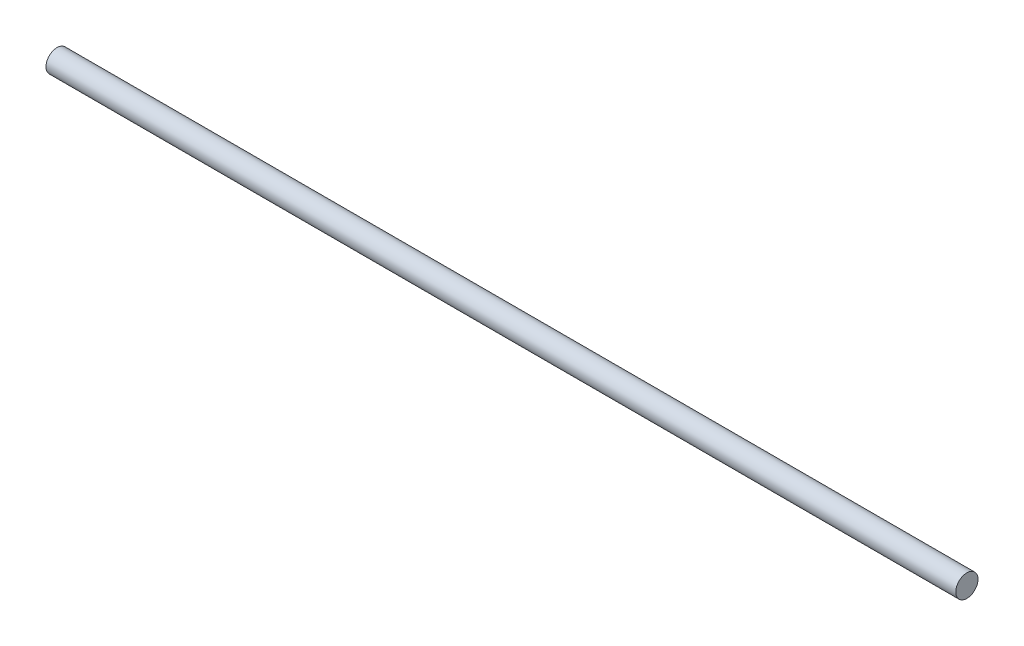
ISO-10303-21;
HEADER;
FILE_DESCRIPTION(('STEP AP214'),'2;1');
FILE_NAME('part.step','',(''),(''),'','','');
FILE_SCHEMA(('AUTOMOTIVE_DESIGN { 1 0 10303 214 1 1 1 1 }'));
ENDSEC;
DATA;
#1=APPLICATION_CONTEXT('core data for automotive mechanical design processes');
#2=APPLICATION_PROTOCOL_DEFINITION('international standard','automotive_design',2000,#1);
#3=PRODUCT_CONTEXT('',#1,'mechanical');
#4=PRODUCT('Part','Part','',(#3));
#5=PRODUCT_RELATED_PRODUCT_CATEGORY('part','',(#4));
#6=PRODUCT_DEFINITION_FORMATION('','',#4);
#7=PRODUCT_DEFINITION_CONTEXT('part definition',#1,'design');
#8=PRODUCT_DEFINITION('design','',#6,#7);
#9=PRODUCT_DEFINITION_SHAPE('','',#8);
#10=(LENGTH_UNIT() NAMED_UNIT(*) SI_UNIT(.MILLI.,.METRE.));
#11=(NAMED_UNIT(*) PLANE_ANGLE_UNIT() SI_UNIT($,.RADIAN.));
#12=(NAMED_UNIT(*) SI_UNIT($,.STERADIAN.) SOLID_ANGLE_UNIT());
#13=UNCERTAINTY_MEASURE_WITH_UNIT(LENGTH_MEASURE(1.E-05),#10,'distance_accuracy_value','');
#14=(GEOMETRIC_REPRESENTATION_CONTEXT(3) GLOBAL_UNCERTAINTY_ASSIGNED_CONTEXT((#13)) GLOBAL_UNIT_ASSIGNED_CONTEXT((#10,
#11,#12)) REPRESENTATION_CONTEXT('',''));
#15=CARTESIAN_POINT('',(0.,0.,0.));
#16=DIRECTION('',(0.,0.,1.));
#17=DIRECTION('',(1.,0.,0.));
#18=AXIS2_PLACEMENT_3D('',#15,#16,#17);
#19=CARTESIAN_POINT('',(-204.571903535321,149.45,-0.999999999999994));
#20=DIRECTION('',(-1.,0.,0.));
#21=DIRECTION('',(0.,0.,1.));
#22=AXIS2_PLACEMENT_3D('',#19,#20,#21);
#23=PLANE('',#22);
#24=CARTESIAN_POINT('',(-204.571903535321,149.45,-0.999999999999994));
#25=DIRECTION('',(-1.,0.,0.));
#26=DIRECTION('',(0.,0.,1.));
#27=AXIS2_PLACEMENT_3D('',#24,#25,#26);
#28=CIRCLE('',#27,3.);
#29=CARTESIAN_POINT('',(-204.571903535321,149.45,2.00000000000001));
#30=VERTEX_POINT('',#29);
#31=EDGE_CURVE('E44',#30,#30,#28,.T.);
#32=ORIENTED_EDGE('',*,*,#31,.F.);
#33=EDGE_LOOP('',(#32));
#34=FACE_BOUND('',#33,.T.);
#35=ADVANCED_FACE('F37',(#34),#23,.F.);
#36=CARTESIAN_POINT('',(-458.485281374239,149.45,-0.999999999999994));
#37=DIRECTION('',(1.,0.,0.));
#38=DIRECTION('',(0.,0.,-1.));
#39=AXIS2_PLACEMENT_3D('',#36,#37,#38);
#40=CYLINDRICAL_SURFACE('',#39,3.);
#41=CARTESIAN_POINT('',(-450.,149.45,-0.999999999999994));
#42=DIRECTION('',(1.,0.,0.));
#43=DIRECTION('',(0.,0.,-1.));
#44=AXIS2_PLACEMENT_3D('',#41,#42,#43);
#45=CIRCLE('',#44,3.);
#46=CARTESIAN_POINT('',(-450.,149.45,-3.99999999999999));
#47=VERTEX_POINT('',#46);
#48=EDGE_CURVE('E10',#47,#47,#45,.T.);
#49=ORIENTED_EDGE('',*,*,#48,.T.);
#50=EDGE_LOOP('',(#49));
#51=FACE_BOUND('',#50,.T.);
#52=ORIENTED_EDGE('',*,*,#31,.T.);
#53=EDGE_LOOP('',(#52));
#54=FACE_BOUND('',#53,.T.);
#55=ADVANCED_FACE('F39',(#51,#54),#40,.T.);
#56=CARTESIAN_POINT('',(-450.,149.45,-0.999999999999994));
#57=DIRECTION('',(1.,0.,0.));
#58=DIRECTION('',(0.,0.,-1.));
#59=AXIS2_PLACEMENT_3D('',#56,#57,#58);
#60=PLANE('',#59);
#61=ORIENTED_EDGE('',*,*,#48,.F.);
#62=EDGE_LOOP('',(#61));
#63=FACE_BOUND('',#62,.T.);
#64=ADVANCED_FACE('F55',(#63),#60,.F.);
#65=CLOSED_SHELL('',(#35,#55,#64));
#66=MANIFOLD_SOLID_BREP('B2',#65);
#67=ADVANCED_BREP_SHAPE_REPRESENTATION('',(#18,#66),#14);
#68=SHAPE_DEFINITION_REPRESENTATION(#9,#67);
ENDSEC;
END-ISO-10303-21;
